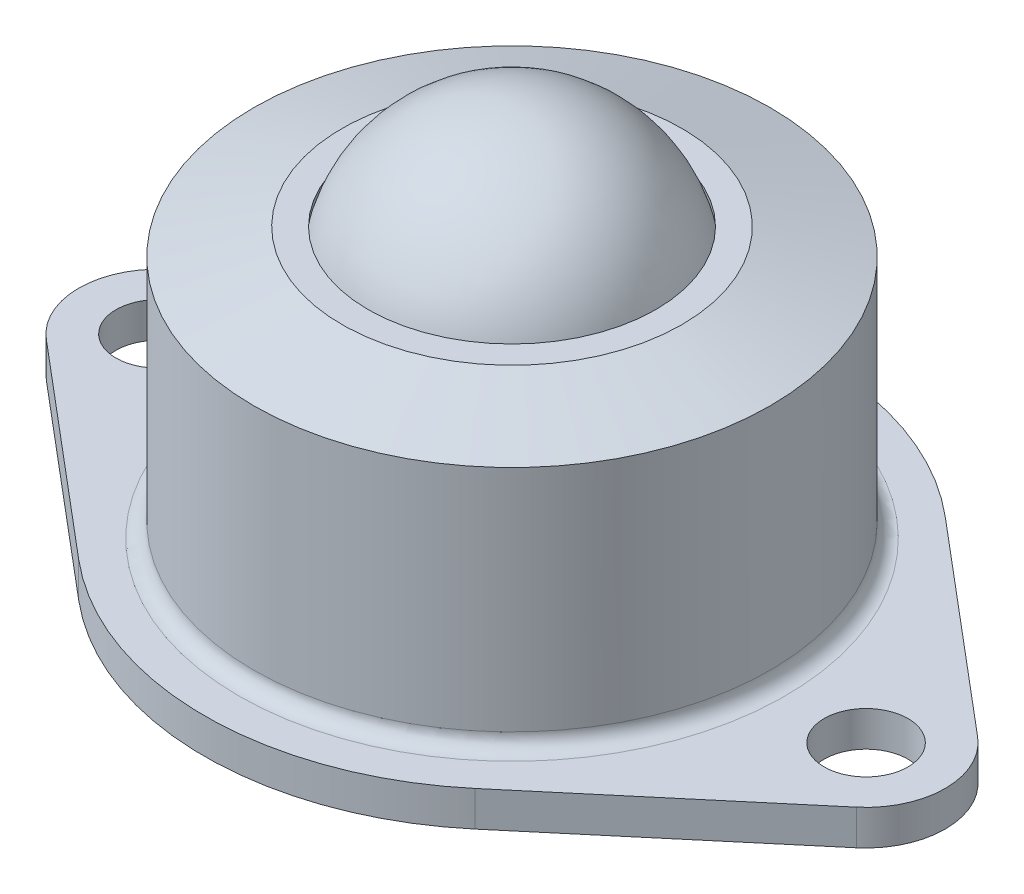
ISO-10303-21;
HEADER;
FILE_DESCRIPTION(('STEP AP214'),'2;1');
FILE_NAME('part.step','',(''),(''),'','','');
FILE_SCHEMA(('AUTOMOTIVE_DESIGN { 1 0 10303 214 1 1 1 1 }'));
ENDSEC;
DATA;
#1=APPLICATION_CONTEXT('core data for automotive mechanical design processes');
#2=APPLICATION_PROTOCOL_DEFINITION('international standard','automotive_design',2000,#1);
#3=PRODUCT_CONTEXT('',#1,'mechanical');
#4=PRODUCT('Part','Part','',(#3));
#5=PRODUCT_RELATED_PRODUCT_CATEGORY('part','',(#4));
#6=PRODUCT_DEFINITION_FORMATION('','',#4);
#7=PRODUCT_DEFINITION_CONTEXT('part definition',#1,'design');
#8=PRODUCT_DEFINITION('design','',#6,#7);
#9=PRODUCT_DEFINITION_SHAPE('','',#8);
#10=(LENGTH_UNIT() NAMED_UNIT(*) SI_UNIT(.MILLI.,.METRE.));
#11=(NAMED_UNIT(*) PLANE_ANGLE_UNIT() SI_UNIT($,.RADIAN.));
#12=(NAMED_UNIT(*) SI_UNIT($,.STERADIAN.) SOLID_ANGLE_UNIT());
#13=UNCERTAINTY_MEASURE_WITH_UNIT(LENGTH_MEASURE(1.E-05),#10,'distance_accuracy_value','');
#14=(GEOMETRIC_REPRESENTATION_CONTEXT(3) GLOBAL_UNCERTAINTY_ASSIGNED_CONTEXT((#13)) GLOBAL_UNIT_ASSIGNED_CONTEXT((#10,
#11,#12)) REPRESENTATION_CONTEXT('',''));
#15=CARTESIAN_POINT('',(0.,0.,0.));
#16=DIRECTION('',(0.,0.,1.));
#17=DIRECTION('',(1.,0.,0.));
#18=AXIS2_PLACEMENT_3D('',#15,#16,#17);
#19=CARTESIAN_POINT('',(0.,22.225,0.));
#20=DIRECTION('',(0.,1.,0.));
#21=DIRECTION('',(1.,0.,0.));
#22=AXIS2_PLACEMENT_3D('',#19,#20,#21);
#23=SPHERICAL_SURFACE('',#22,12.7);
#24=CARTESIAN_POINT('',(0.,34.925,0.));
#25=VERTEX_POINT('',#24);
#26=VERTEX_LOOP('',#25);
#27=FACE_BOUND('',#26,.T.);
#28=ADVANCED_FACE('F41',(#27),#23,.T.);
#29=CLOSED_SHELL('',(#28));
#30=MANIFOLD_SOLID_BREP('B2',#29);
#31=CARTESIAN_POINT('',(0.,3.,0.));
#32=DIRECTION('',(0.,1.,0.));
#33=DIRECTION('',(0.,0.,1.));
#34=AXIS2_PLACEMENT_3D('',#31,#32,#33);
#35=PLANE('',#34);
#36=CARTESIAN_POINT('',(0.,3.,0.));
#37=DIRECTION('',(0.,1.,0.));
#38=DIRECTION('',(0.,0.,1.));
#39=AXIS2_PLACEMENT_3D('',#36,#37,#38);
#40=CIRCLE('',#39,23.27);
#41=CARTESIAN_POINT('',(0.,3.,23.27));
#42=VERTEX_POINT('',#41);
#43=EDGE_CURVE('E62',#42,#42,#40,.F.);
#44=ORIENTED_EDGE('',*,*,#43,.T.);
#45=EDGE_LOOP('',(#44));
#46=FACE_BOUND('',#45,.T.);
#47=CARTESIAN_POINT('',(30.1625,3.,0.));
#48=DIRECTION('',(0.,1.,0.));
#49=DIRECTION('',(0.,0.,1.));
#50=AXIS2_PLACEMENT_3D('',#47,#48,#49);
#51=CIRCLE('',#50,3.571875);
#52=CARTESIAN_POINT('',(30.1625,3.,3.57187499999999));
#53=VERTEX_POINT('',#52);
#54=EDGE_CURVE('E264',#53,#53,#51,.T.);
#55=ORIENTED_EDGE('',*,*,#54,.F.);
#56=EDGE_LOOP('',(#55));
#57=FACE_BOUND('',#56,.T.);
#58=CARTESIAN_POINT('',(0.,3.,0.));
#59=DIRECTION('',(0.,1.,0.));
#60=DIRECTION('',(0.,0.,1.));
#61=AXIS2_PLACEMENT_3D('',#58,#59,#60);
#62=CIRCLE('',#61,26.19375);
#63=CARTESIAN_POINT('',(16.8880756578947,3.,-20.0226231956685));
#64=VERTEX_POINT('',#63);
#65=CARTESIAN_POINT('',(-16.8880756578947,3.,-20.0226231956685));
#66=VERTEX_POINT('',#65);
#67=EDGE_CURVE('E166',#64,#66,#62,.T.);
#68=ORIENTED_EDGE('',*,*,#67,.T.);
#69=DIRECTION('',(-0.764404607804095,0.,0.644736842105263));
#70=VECTOR('',#69,1.);
#71=CARTESIAN_POINT('',(-16.8880756578947,3.,-20.0226231956685));
#72=LINE('',#71,#70);
#73=CARTESIAN_POINT('',(-34.5124588815789,3.,-5.15734233827826));
#74=VERTEX_POINT('',#73);
#75=EDGE_CURVE('E114',#66,#74,#72,.T.);
#76=ORIENTED_EDGE('',*,*,#75,.T.);
#77=CARTESIAN_POINT('',(-30.1625,3.,0.));
#78=DIRECTION('',(0.,1.,0.));
#79=DIRECTION('',(0.,0.,1.));
#80=AXIS2_PLACEMENT_3D('',#77,#78,#79);
#81=CIRCLE('',#80,6.746875);
#82=CARTESIAN_POINT('',(-34.5124588815789,3.,5.15734233827826));
#83=VERTEX_POINT('',#82);
#84=EDGE_CURVE('E278',#74,#83,#81,.T.);
#85=ORIENTED_EDGE('',*,*,#84,.T.);
#86=DIRECTION('',(0.764404607804095,0.,0.644736842105263));
#87=VECTOR('',#86,1.);
#88=CARTESIAN_POINT('',(-34.5124588815789,3.,5.15734233827826));
#89=LINE('',#88,#87);
#90=CARTESIAN_POINT('',(-16.8880756578947,3.,20.0226231956685));
#91=VERTEX_POINT('',#90);
#92=EDGE_CURVE('E280',#83,#91,#89,.T.);
#93=ORIENTED_EDGE('',*,*,#92,.T.);
#94=CARTESIAN_POINT('',(0.,3.,0.));
#95=DIRECTION('',(0.,1.,0.));
#96=DIRECTION('',(0.,0.,1.));
#97=AXIS2_PLACEMENT_3D('',#94,#95,#96);
#98=CIRCLE('',#97,26.19375);
#99=CARTESIAN_POINT('',(16.8880756578948,3.,20.0226231956685));
#100=VERTEX_POINT('',#99);
#101=EDGE_CURVE('E133',#91,#100,#98,.T.);
#102=ORIENTED_EDGE('',*,*,#101,.T.);
#103=DIRECTION('',(0.764404607804095,0.,-0.644736842105264));
#104=VECTOR('',#103,1.);
#105=CARTESIAN_POINT('',(16.8880756578947,3.,20.0226231956685));
#106=LINE('',#105,#104);
#107=CARTESIAN_POINT('',(34.5124588815789,3.,5.15734233827825));
#108=VERTEX_POINT('',#107);
#109=EDGE_CURVE('E127',#100,#108,#106,.T.);
#110=ORIENTED_EDGE('',*,*,#109,.T.);
#111=CARTESIAN_POINT('',(30.1625,3.,0.));
#112=DIRECTION('',(0.,1.,0.));
#113=DIRECTION('',(0.,0.,-1.));
#114=AXIS2_PLACEMENT_3D('',#111,#112,#113);
#115=CIRCLE('',#114,6.746875);
#116=CARTESIAN_POINT('',(34.5124588815789,3.,-5.15734233827826));
#117=VERTEX_POINT('',#116);
#118=EDGE_CURVE('E131',#108,#117,#115,.T.);
#119=ORIENTED_EDGE('',*,*,#118,.T.);
#120=DIRECTION('',(-0.764404607804095,0.,-0.644736842105263));
#121=VECTOR('',#120,1.);
#122=CARTESIAN_POINT('',(34.5124588815789,3.,-5.15734233827826));
#123=LINE('',#122,#121);
#124=EDGE_CURVE('E70',#117,#64,#123,.T.);
#125=ORIENTED_EDGE('',*,*,#124,.T.);
#126=EDGE_LOOP('',(#68,#76,#85,#93,#102,#110,#119,#125));
#127=FACE_BOUND('',#126,.T.);
#128=CARTESIAN_POINT('',(-30.1625,3.,0.));
#129=DIRECTION('',(0.,1.,0.));
#130=DIRECTION('',(0.,0.,1.));
#131=AXIS2_PLACEMENT_3D('',#128,#129,#130);
#132=CIRCLE('',#131,3.571875);
#133=CARTESIAN_POINT('',(-30.1625,3.,3.571875));
#134=VERTEX_POINT('',#133);
#135=EDGE_CURVE('E155',#134,#134,#132,.T.);
#136=ORIENTED_EDGE('',*,*,#135,.F.);
#137=EDGE_LOOP('',(#136));
#138=FACE_BOUND('',#137,.T.);
#139=ADVANCED_FACE('F53',(#46,#57,#127,#138),#35,.T.);
#140=CARTESIAN_POINT('',(0.,0.,0.));
#141=DIRECTION('',(0.,1.,0.));
#142=DIRECTION('',(0.,0.,1.));
#143=AXIS2_PLACEMENT_3D('',#140,#141,#142);
#144=PLANE('',#143);
#145=CARTESIAN_POINT('',(30.1625,0.,0.));
#146=DIRECTION('',(0.,1.,0.));
#147=DIRECTION('',(0.,0.,1.));
#148=AXIS2_PLACEMENT_3D('',#145,#146,#147);
#149=CIRCLE('',#148,3.571875);
#150=CARTESIAN_POINT('',(30.1625,0.,3.57187499999999));
#151=VERTEX_POINT('',#150);
#152=EDGE_CURVE('E183',#151,#151,#149,.T.);
#153=ORIENTED_EDGE('',*,*,#152,.T.);
#154=EDGE_LOOP('',(#153));
#155=FACE_BOUND('',#154,.T.);
#156=CARTESIAN_POINT('',(0.,0.,0.));
#157=DIRECTION('',(0.,1.,0.));
#158=DIRECTION('',(0.,0.,1.));
#159=AXIS2_PLACEMENT_3D('',#156,#157,#158);
#160=CIRCLE('',#159,26.19375);
#161=CARTESIAN_POINT('',(16.8880756578947,0.,-20.0226231956685));
#162=VERTEX_POINT('',#161);
#163=CARTESIAN_POINT('',(-16.8880756578947,0.,-20.0226231956685));
#164=VERTEX_POINT('',#163);
#165=EDGE_CURVE('E151',#162,#164,#160,.T.);
#166=ORIENTED_EDGE('',*,*,#165,.F.);
#167=DIRECTION('',(-0.764404607804095,0.,-0.644736842105263));
#168=VECTOR('',#167,1.);
#169=CARTESIAN_POINT('',(34.5124588815789,0.,-5.15734233827826));
#170=LINE('',#169,#168);
#171=CARTESIAN_POINT('',(34.5124588815789,0.,-5.15734233827826));
#172=VERTEX_POINT('',#171);
#173=EDGE_CURVE('E105',#172,#162,#170,.T.);
#174=ORIENTED_EDGE('',*,*,#173,.F.);
#175=CARTESIAN_POINT('',(30.1625,0.,0.));
#176=DIRECTION('',(0.,1.,0.));
#177=DIRECTION('',(0.,0.,-1.));
#178=AXIS2_PLACEMENT_3D('',#175,#176,#177);
#179=CIRCLE('',#178,6.746875);
#180=CARTESIAN_POINT('',(34.5124588815789,0.,5.15734233827825));
#181=VERTEX_POINT('',#180);
#182=EDGE_CURVE('E99',#181,#172,#179,.T.);
#183=ORIENTED_EDGE('',*,*,#182,.F.);
#184=DIRECTION('',(0.764404607804095,0.,-0.644736842105264));
#185=VECTOR('',#184,1.);
#186=CARTESIAN_POINT('',(16.8880756578947,0.,20.0226231956685));
#187=LINE('',#186,#185);
#188=CARTESIAN_POINT('',(16.8880756578948,0.,20.0226231956685));
#189=VERTEX_POINT('',#188);
#190=EDGE_CURVE('E141',#189,#181,#187,.T.);
#191=ORIENTED_EDGE('',*,*,#190,.F.);
#192=CARTESIAN_POINT('',(0.,0.,0.));
#193=DIRECTION('',(0.,1.,0.));
#194=DIRECTION('',(0.,0.,1.));
#195=AXIS2_PLACEMENT_3D('',#192,#193,#194);
#196=CIRCLE('',#195,26.19375);
#197=CARTESIAN_POINT('',(-16.8880756578947,0.,20.0226231956685));
#198=VERTEX_POINT('',#197);
#199=EDGE_CURVE('E161',#198,#189,#196,.T.);
#200=ORIENTED_EDGE('',*,*,#199,.F.);
#201=DIRECTION('',(0.764404607804095,0.,0.644736842105263));
#202=VECTOR('',#201,1.);
#203=CARTESIAN_POINT('',(-34.5124588815789,0.,5.15734233827826));
#204=LINE('',#203,#202);
#205=CARTESIAN_POINT('',(-34.5124588815789,0.,5.15734233827826));
#206=VERTEX_POINT('',#205);
#207=EDGE_CURVE('E159',#206,#198,#204,.T.);
#208=ORIENTED_EDGE('',*,*,#207,.F.);
#209=CARTESIAN_POINT('',(-30.1625,0.,0.));
#210=DIRECTION('',(0.,1.,0.));
#211=DIRECTION('',(0.,0.,1.));
#212=AXIS2_PLACEMENT_3D('',#209,#210,#211);
#213=CIRCLE('',#212,6.746875);
#214=CARTESIAN_POINT('',(-34.5124588815789,0.,-5.15734233827826));
#215=VERTEX_POINT('',#214);
#216=EDGE_CURVE('E157',#215,#206,#213,.T.);
#217=ORIENTED_EDGE('',*,*,#216,.F.);
#218=DIRECTION('',(-0.764404607804095,0.,0.644736842105263));
#219=VECTOR('',#218,1.);
#220=CARTESIAN_POINT('',(-16.8880756578947,0.,-20.0226231956685));
#221=LINE('',#220,#219);
#222=EDGE_CURVE('E154',#164,#215,#221,.T.);
#223=ORIENTED_EDGE('',*,*,#222,.F.);
#224=EDGE_LOOP('',(#166,#174,#183,#191,#200,#208,#217,#223));
#225=FACE_BOUND('',#224,.T.);
#226=CARTESIAN_POINT('',(-30.1625,0.,0.));
#227=DIRECTION('',(0.,1.,0.));
#228=DIRECTION('',(0.,0.,1.));
#229=AXIS2_PLACEMENT_3D('',#226,#227,#228);
#230=CIRCLE('',#229,3.571875);
#231=CARTESIAN_POINT('',(-30.1625,0.,3.571875));
#232=VERTEX_POINT('',#231);
#233=EDGE_CURVE('E268',#232,#232,#230,.T.);
#234=ORIENTED_EDGE('',*,*,#233,.T.);
#235=EDGE_LOOP('',(#234));
#236=FACE_BOUND('',#235,.T.);
#237=ADVANCED_FACE('F206',(#155,#225,#236),#144,.F.);
#238=CARTESIAN_POINT('',(0.,3.,0.));
#239=DIRECTION('',(0.,-1.,0.));
#240=DIRECTION('',(0.,0.,-1.));
#241=AXIS2_PLACEMENT_3D('',#238,#239,#240);
#242=CYLINDRICAL_SURFACE('',#241,26.19375);
#243=ORIENTED_EDGE('',*,*,#165,.T.);
#244=DIRECTION('',(0.,-1.,0.));
#245=VECTOR('',#244,1.);
#246=CARTESIAN_POINT('',(-16.8880756578947,3.,-20.0226231956685));
#247=LINE('',#246,#245);
#248=EDGE_CURVE('E179',#66,#164,#247,.T.);
#249=ORIENTED_EDGE('',*,*,#248,.F.);
#250=ORIENTED_EDGE('',*,*,#67,.F.);
#251=DIRECTION('',(0.,-1.,0.));
#252=VECTOR('',#251,1.);
#253=CARTESIAN_POINT('',(16.8880756578947,3.,-20.0226231956685));
#254=LINE('',#253,#252);
#255=EDGE_CURVE('E147',#64,#162,#254,.T.);
#256=ORIENTED_EDGE('',*,*,#255,.T.);
#257=EDGE_LOOP('',(#243,#249,#250,#256));
#258=FACE_BOUND('',#257,.T.);
#259=ADVANCED_FACE('F211',(#258),#242,.T.);
#260=CARTESIAN_POINT('',(-16.8880756578947,3.,-20.0226231956685));
#261=DIRECTION('',(0.644736842105263,0.,0.764404607804096));
#262=DIRECTION('',(0.764404607804096,0.,-0.644736842105263));
#263=AXIS2_PLACEMENT_3D('',#260,#261,#262);
#264=PLANE('',#263);
#265=ORIENTED_EDGE('',*,*,#222,.T.);
#266=DIRECTION('',(0.,-1.,0.));
#267=VECTOR('',#266,1.);
#268=CARTESIAN_POINT('',(-34.5124588815789,3.,-5.15734233827826));
#269=LINE('',#268,#267);
#270=EDGE_CURVE('E176',#74,#215,#269,.T.);
#271=ORIENTED_EDGE('',*,*,#270,.F.);
#272=ORIENTED_EDGE('',*,*,#75,.F.);
#273=ORIENTED_EDGE('',*,*,#248,.T.);
#274=EDGE_LOOP('',(#265,#271,#272,#273));
#275=FACE_BOUND('',#274,.T.);
#276=ADVANCED_FACE('F236',(#275),#264,.F.);
#277=CARTESIAN_POINT('',(-30.1625,3.,0.));
#278=DIRECTION('',(0.,-1.,0.));
#279=DIRECTION('',(0.,0.,-1.));
#280=AXIS2_PLACEMENT_3D('',#277,#278,#279);
#281=CYLINDRICAL_SURFACE('',#280,6.746875);
#282=ORIENTED_EDGE('',*,*,#216,.T.);
#283=DIRECTION('',(0.,-1.,0.));
#284=VECTOR('',#283,1.);
#285=CARTESIAN_POINT('',(-34.5124588815789,3.,5.15734233827826));
#286=LINE('',#285,#284);
#287=EDGE_CURVE('E173',#83,#206,#286,.T.);
#288=ORIENTED_EDGE('',*,*,#287,.F.);
#289=ORIENTED_EDGE('',*,*,#84,.F.);
#290=ORIENTED_EDGE('',*,*,#270,.T.);
#291=EDGE_LOOP('',(#282,#288,#289,#290));
#292=FACE_BOUND('',#291,.T.);
#293=ADVANCED_FACE('F232',(#292),#281,.T.);
#294=CARTESIAN_POINT('',(-34.5124588815789,3.,5.15734233827826));
#295=DIRECTION('',(0.644736842105263,0.,-0.764404607804095));
#296=DIRECTION('',(-0.764404607804095,0.,-0.644736842105263));
#297=AXIS2_PLACEMENT_3D('',#294,#295,#296);
#298=PLANE('',#297);
#299=ORIENTED_EDGE('',*,*,#207,.T.);
#300=DIRECTION('',(0.,-1.,0.));
#301=VECTOR('',#300,1.);
#302=CARTESIAN_POINT('',(-16.8880756578947,3.,20.0226231956685));
#303=LINE('',#302,#301);
#304=EDGE_CURVE('E170',#91,#198,#303,.T.);
#305=ORIENTED_EDGE('',*,*,#304,.F.);
#306=ORIENTED_EDGE('',*,*,#92,.F.);
#307=ORIENTED_EDGE('',*,*,#287,.T.);
#308=EDGE_LOOP('',(#299,#305,#306,#307));
#309=FACE_BOUND('',#308,.T.);
#310=ADVANCED_FACE('F228',(#309),#298,.F.);
#311=CARTESIAN_POINT('',(0.,3.,0.));
#312=DIRECTION('',(0.,-1.,0.));
#313=DIRECTION('',(0.,0.,-1.));
#314=AXIS2_PLACEMENT_3D('',#311,#312,#313);
#315=CYLINDRICAL_SURFACE('',#314,26.19375);
#316=ORIENTED_EDGE('',*,*,#199,.T.);
#317=DIRECTION('',(0.,-1.,0.));
#318=VECTOR('',#317,1.);
#319=CARTESIAN_POINT('',(16.8880756578948,3.,20.0226231956685));
#320=LINE('',#319,#318);
#321=EDGE_CURVE('E142',#100,#189,#320,.T.);
#322=ORIENTED_EDGE('',*,*,#321,.F.);
#323=ORIENTED_EDGE('',*,*,#101,.F.);
#324=ORIENTED_EDGE('',*,*,#304,.T.);
#325=EDGE_LOOP('',(#316,#322,#323,#324));
#326=FACE_BOUND('',#325,.T.);
#327=ADVANCED_FACE('F225',(#326),#315,.T.);
#328=CARTESIAN_POINT('',(16.8880756578947,3.,20.0226231956685));
#329=DIRECTION('',(-0.644736842105264,0.,-0.764404607804095));
#330=DIRECTION('',(-0.764404607804095,0.,0.644736842105264));
#331=AXIS2_PLACEMENT_3D('',#328,#329,#330);
#332=PLANE('',#331);
#333=ORIENTED_EDGE('',*,*,#190,.T.);
#334=DIRECTION('',(0.,-1.,0.));
#335=VECTOR('',#334,1.);
#336=CARTESIAN_POINT('',(34.5124588815789,3.,5.15734233827825));
#337=LINE('',#336,#335);
#338=EDGE_CURVE('E138',#108,#181,#337,.T.);
#339=ORIENTED_EDGE('',*,*,#338,.F.);
#340=ORIENTED_EDGE('',*,*,#109,.F.);
#341=ORIENTED_EDGE('',*,*,#321,.T.);
#342=EDGE_LOOP('',(#333,#339,#340,#341));
#343=FACE_BOUND('',#342,.T.);
#344=ADVANCED_FACE('F139',(#343),#332,.F.);
#345=CARTESIAN_POINT('',(30.1625,3.,0.));
#346=DIRECTION('',(0.,-1.,0.));
#347=DIRECTION('',(0.,0.,-1.));
#348=AXIS2_PLACEMENT_3D('',#345,#346,#347);
#349=CYLINDRICAL_SURFACE('',#348,6.746875);
#350=ORIENTED_EDGE('',*,*,#182,.T.);
#351=DIRECTION('',(0.,-1.,0.));
#352=VECTOR('',#351,1.);
#353=CARTESIAN_POINT('',(34.5124588815789,3.,-5.15734233827826));
#354=LINE('',#353,#352);
#355=EDGE_CURVE('E143',#117,#172,#354,.T.);
#356=ORIENTED_EDGE('',*,*,#355,.F.);
#357=ORIENTED_EDGE('',*,*,#118,.F.);
#358=ORIENTED_EDGE('',*,*,#338,.T.);
#359=EDGE_LOOP('',(#350,#356,#357,#358));
#360=FACE_BOUND('',#359,.T.);
#361=ADVANCED_FACE('F145',(#360),#349,.T.);
#362=CARTESIAN_POINT('',(34.5124588815789,3.,-5.15734233827826));
#363=DIRECTION('',(-0.644736842105263,0.,0.764404607804096));
#364=DIRECTION('',(0.764404607804096,0.,0.644736842105263));
#365=AXIS2_PLACEMENT_3D('',#362,#363,#364);
#366=PLANE('',#365);
#367=ORIENTED_EDGE('',*,*,#173,.T.);
#368=ORIENTED_EDGE('',*,*,#255,.F.);
#369=ORIENTED_EDGE('',*,*,#124,.F.);
#370=ORIENTED_EDGE('',*,*,#355,.T.);
#371=EDGE_LOOP('',(#367,#368,#369,#370));
#372=FACE_BOUND('',#371,.T.);
#373=ADVANCED_FACE('F218',(#372),#366,.F.);
#374=CARTESIAN_POINT('',(-30.1625,3.,0.));
#375=DIRECTION('',(0.,-1.,0.));
#376=DIRECTION('',(0.,0.,-1.));
#377=AXIS2_PLACEMENT_3D('',#374,#375,#376);
#378=CYLINDRICAL_SURFACE('',#377,3.571875);
#379=ORIENTED_EDGE('',*,*,#135,.T.);
#380=EDGE_LOOP('',(#379));
#381=FACE_BOUND('',#380,.T.);
#382=ORIENTED_EDGE('',*,*,#233,.F.);
#383=EDGE_LOOP('',(#382));
#384=FACE_BOUND('',#383,.T.);
#385=ADVANCED_FACE('F215',(#381,#384),#378,.F.);
#386=CARTESIAN_POINT('',(30.1625,3.,0.));
#387=DIRECTION('',(0.,-1.,0.));
#388=DIRECTION('',(0.,0.,-1.));
#389=AXIS2_PLACEMENT_3D('',#386,#387,#388);
#390=CYLINDRICAL_SURFACE('',#389,3.571875);
#391=ORIENTED_EDGE('',*,*,#54,.T.);
#392=EDGE_LOOP('',(#391));
#393=FACE_BOUND('',#392,.T.);
#394=ORIENTED_EDGE('',*,*,#152,.F.);
#395=EDGE_LOOP('',(#394));
#396=FACE_BOUND('',#395,.T.);
#397=ADVANCED_FACE('F201',(#393,#396),#390,.F.);
#398=CARTESIAN_POINT('',(0.,26.,0.));
#399=DIRECTION('',(0.,1.,0.));
#400=DIRECTION('',(-1.,0.,0.));
#401=AXIS2_PLACEMENT_3D('',#398,#399,#400);
#402=CYLINDRICAL_SURFACE('',#401,22.);
#403=CARTESIAN_POINT('',(0.,23.7744,0.));
#404=DIRECTION('',(0.,-1.,0.));
#405=DIRECTION('',(1.,0.,0.));
#406=AXIS2_PLACEMENT_3D('',#403,#404,#405);
#407=CIRCLE('',#406,22.);
#408=CARTESIAN_POINT('',(22.,23.7744,0.));
#409=VERTEX_POINT('',#408);
#410=EDGE_CURVE('E184',#409,#409,#407,.T.);
#411=ORIENTED_EDGE('',*,*,#410,.T.);
#412=EDGE_LOOP('',(#411));
#413=FACE_BOUND('',#412,.T.);
#414=CARTESIAN_POINT('',(0.,4.27,0.));
#415=DIRECTION('',(0.,1.,0.));
#416=DIRECTION('',(0.,0.,1.));
#417=AXIS2_PLACEMENT_3D('',#414,#415,#416);
#418=CIRCLE('',#417,22.);
#419=CARTESIAN_POINT('',(0.,4.27,22.));
#420=VERTEX_POINT('',#419);
#421=EDGE_CURVE('E39',#420,#420,#418,.T.);
#422=ORIENTED_EDGE('',*,*,#421,.T.);
#423=EDGE_LOOP('',(#422));
#424=FACE_BOUND('',#423,.T.);
#425=ADVANCED_FACE('F192',(#413,#424),#402,.T.);
#426=CARTESIAN_POINT('',(0.,4.27,0.));
#427=DIRECTION('',(0.,1.,0.));
#428=DIRECTION('',(0.,0.,1.));
#429=AXIS2_PLACEMENT_3D('',#426,#427,#428);
#430=TOROIDAL_SURFACE('',#429,23.27,1.27);
#431=ORIENTED_EDGE('',*,*,#421,.F.);
#432=EDGE_LOOP('',(#431));
#433=FACE_BOUND('',#432,.T.);
#434=ORIENTED_EDGE('',*,*,#43,.F.);
#435=EDGE_LOOP('',(#434));
#436=FACE_BOUND('',#435,.T.);
#437=ADVANCED_FACE('F55',(#433,#436),#430,.F.);
#438=CARTESIAN_POINT('',(0.,26.,0.));
#439=DIRECTION('',(0.,-1.,0.));
#440=DIRECTION('',(1.,0.,0.));
#441=AXIS2_PLACEMENT_3D('',#438,#439,#440);
#442=CONICAL_SURFACE('',#441,14.478,1.28312476592126);
#443=ORIENTED_EDGE('',*,*,#410,.F.);
#444=EDGE_LOOP('',(#443));
#445=FACE_BOUND('',#444,.T.);
#446=CARTESIAN_POINT('',(0.,26.,0.));
#447=DIRECTION('',(0.,-1.,0.));
#448=DIRECTION('',(1.,0.,0.));
#449=AXIS2_PLACEMENT_3D('',#446,#447,#448);
#450=CIRCLE('',#449,14.478);
#451=CARTESIAN_POINT('',(14.478,26.,0.));
#452=VERTEX_POINT('',#451);
#453=EDGE_CURVE('E298',#452,#452,#450,.T.);
#454=ORIENTED_EDGE('',*,*,#453,.T.);
#455=EDGE_LOOP('',(#454));
#456=FACE_BOUND('',#455,.T.);
#457=ADVANCED_FACE('F191',(#445,#456),#442,.T.);
#458=CARTESIAN_POINT('',(0.,22.225,0.));
#459=DIRECTION('',(0.,1.,0.));
#460=DIRECTION('',(1.,0.,0.));
#461=AXIS2_PLACEMENT_3D('',#458,#459,#460);
#462=SPHERICAL_SURFACE('',#461,12.827);
#463=CARTESIAN_POINT('',(0.,26.,0.));
#464=DIRECTION('',(0.,-1.,0.));
#465=DIRECTION('',(1.,0.,0.));
#466=AXIS2_PLACEMENT_3D('',#463,#464,#465);
#467=CIRCLE('',#466,12.2589275224222);
#468=CARTESIAN_POINT('',(12.2589275224222,26.,0.));
#469=VERTEX_POINT('',#468);
#470=EDGE_CURVE('E181',#469,#469,#467,.F.);
#471=ORIENTED_EDGE('',*,*,#470,.T.);
#472=EDGE_LOOP('',(#471));
#473=FACE_BOUND('',#472,.T.);
#474=ADVANCED_FACE('F198',(#473),#462,.F.);
#475=CARTESIAN_POINT('',(-22.,26.,1.53625178909098E-13));
#476=DIRECTION('',(0.,-1.,0.));
#477=DIRECTION('',(1.,0.,0.));
#478=AXIS2_PLACEMENT_3D('',#475,#476,#477);
#479=PLANE('',#478);
#480=ORIENTED_EDGE('',*,*,#453,.F.);
#481=EDGE_LOOP('',(#480));
#482=FACE_BOUND('',#481,.T.);
#483=ORIENTED_EDGE('',*,*,#470,.F.);
#484=EDGE_LOOP('',(#483));
#485=FACE_BOUND('',#484,.T.);
#486=ADVANCED_FACE('F243',(#482,#485),#479,.F.);
#487=CLOSED_SHELL('',(#139,#237,#259,#276,#293,#310,#327,#344,#361,#373,#385,#397,#425,#437,
#457,#474,#486));
#488=MANIFOLD_SOLID_BREP('B7',#487);
#489=ADVANCED_BREP_SHAPE_REPRESENTATION('',(#18,#30,#488),#14);
#490=SHAPE_DEFINITION_REPRESENTATION(#9,#489);
ENDSEC;
END-ISO-10303-21;
